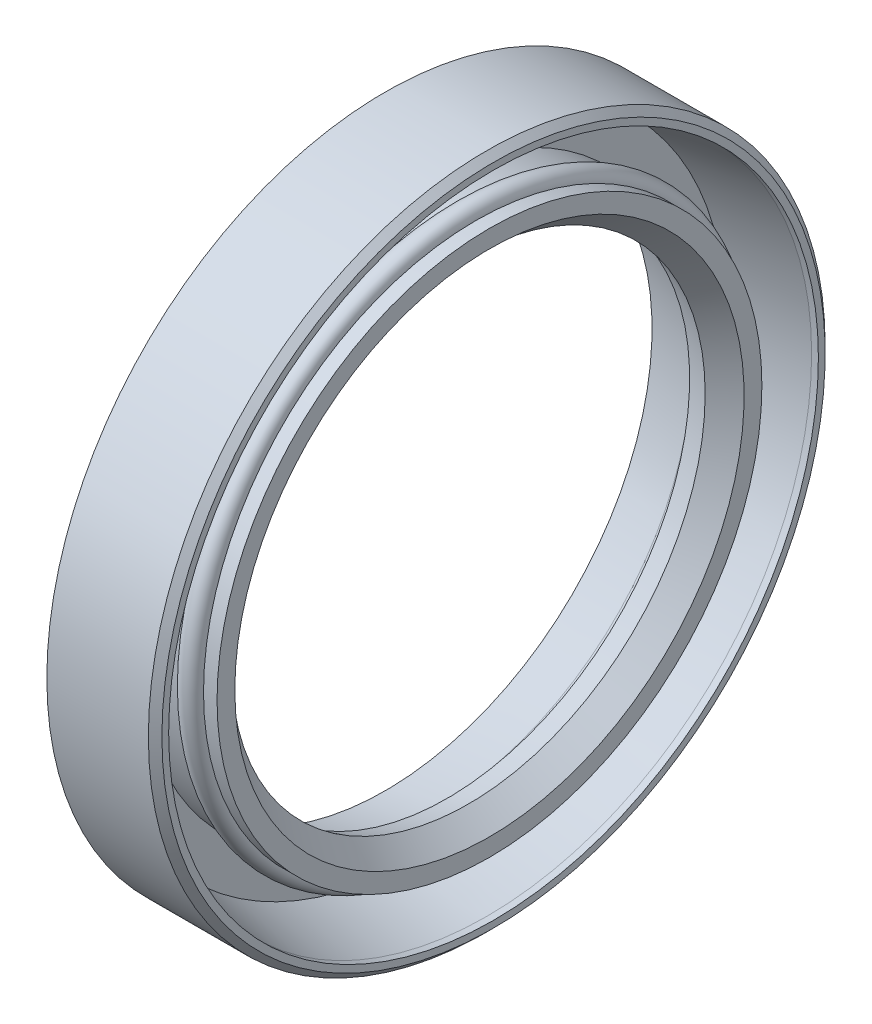
ISO-10303-21;
HEADER;
FILE_DESCRIPTION(('STEP AP214'),'2;1');
FILE_NAME('part.step','',(''),(''),'','','');
FILE_SCHEMA(('AUTOMOTIVE_DESIGN { 1 0 10303 214 1 1 1 1 }'));
ENDSEC;
DATA;
#1=APPLICATION_CONTEXT('core data for automotive mechanical design processes');
#2=APPLICATION_PROTOCOL_DEFINITION('international standard','automotive_design',2000,#1);
#3=PRODUCT_CONTEXT('',#1,'mechanical');
#4=PRODUCT('Part','Part','',(#3));
#5=PRODUCT_RELATED_PRODUCT_CATEGORY('part','',(#4));
#6=PRODUCT_DEFINITION_FORMATION('','',#4);
#7=PRODUCT_DEFINITION_CONTEXT('part definition',#1,'design');
#8=PRODUCT_DEFINITION('design','',#6,#7);
#9=PRODUCT_DEFINITION_SHAPE('','',#8);
#10=(LENGTH_UNIT() NAMED_UNIT(*) SI_UNIT(.MILLI.,.METRE.));
#11=(NAMED_UNIT(*) PLANE_ANGLE_UNIT() SI_UNIT($,.RADIAN.));
#12=(NAMED_UNIT(*) SI_UNIT($,.STERADIAN.) SOLID_ANGLE_UNIT());
#13=UNCERTAINTY_MEASURE_WITH_UNIT(LENGTH_MEASURE(1.E-05),#10,'distance_accuracy_value','');
#14=(GEOMETRIC_REPRESENTATION_CONTEXT(3) GLOBAL_UNCERTAINTY_ASSIGNED_CONTEXT((#13)) GLOBAL_UNIT_ASSIGNED_CONTEXT((#10,
#11,#12)) REPRESENTATION_CONTEXT('',''));
#15=CARTESIAN_POINT('',(0.,0.,0.));
#16=DIRECTION('',(0.,0.,1.));
#17=DIRECTION('',(1.,0.,0.));
#18=AXIS2_PLACEMENT_3D('',#15,#16,#17);
#19=CARTESIAN_POINT('',(7.99999999999999,0.,0.));
#20=DIRECTION('',(-1.,0.,0.));
#21=DIRECTION('',(0.,0.,1.));
#22=AXIS2_PLACEMENT_3D('',#19,#20,#21);
#23=CONICAL_SURFACE('',#22,24.5,0.785398163397448);
#24=CARTESIAN_POINT('',(7.49999999999999,0.,0.));
#25=DIRECTION('',(-1.,0.,0.));
#26=DIRECTION('',(0.,0.,1.));
#27=AXIS2_PLACEMENT_3D('',#24,#25,#26);
#28=CIRCLE('',#27,25.);
#29=CARTESIAN_POINT('',(7.49999999999999,0.,25.));
#30=VERTEX_POINT('',#29);
#31=EDGE_CURVE('E84',#30,#30,#28,.T.);
#32=ORIENTED_EDGE('',*,*,#31,.F.);
#33=EDGE_LOOP('',(#32));
#34=FACE_BOUND('',#33,.T.);
#35=CARTESIAN_POINT('',(7.99999999999999,0.,0.));
#36=DIRECTION('',(-1.,0.,0.));
#37=DIRECTION('',(0.,0.,1.));
#38=AXIS2_PLACEMENT_3D('',#35,#36,#37);
#39=CIRCLE('',#38,24.5);
#40=CARTESIAN_POINT('',(7.99999999999999,0.,24.5));
#41=VERTEX_POINT('',#40);
#42=EDGE_CURVE('E10',#41,#41,#39,.T.);
#43=ORIENTED_EDGE('',*,*,#42,.T.);
#44=EDGE_LOOP('',(#43));
#45=FACE_BOUND('',#44,.T.);
#46=ADVANCED_FACE('F34',(#34,#45),#23,.T.);
#47=CARTESIAN_POINT('',(7.99999999999999,24.,0.));
#48=DIRECTION('',(-1.,0.,0.));
#49=DIRECTION('',(0.,0.,1.));
#50=AXIS2_PLACEMENT_3D('',#47,#48,#49);
#51=PLANE('',#50);
#52=ORIENTED_EDGE('',*,*,#42,.F.);
#53=EDGE_LOOP('',(#52));
#54=FACE_BOUND('',#53,.T.);
#55=CARTESIAN_POINT('',(7.99999999999999,0.,0.));
#56=DIRECTION('',(-1.,0.,0.));
#57=DIRECTION('',(0.,0.,1.));
#58=AXIS2_PLACEMENT_3D('',#55,#56,#57);
#59=CIRCLE('',#58,24.);
#60=CARTESIAN_POINT('',(7.99999999999999,0.,24.));
#61=VERTEX_POINT('',#60);
#62=EDGE_CURVE('E41',#61,#61,#59,.T.);
#63=ORIENTED_EDGE('',*,*,#62,.T.);
#64=EDGE_LOOP('',(#63));
#65=FACE_BOUND('',#64,.T.);
#66=ADVANCED_FACE('F91',(#54,#65),#51,.F.);
#67=CARTESIAN_POINT('',(0.,0.,0.));
#68=DIRECTION('',(-1.,0.,0.));
#69=DIRECTION('',(0.,0.,1.));
#70=AXIS2_PLACEMENT_3D('',#67,#68,#69);
#71=CYLINDRICAL_SURFACE('',#70,24.);
#72=ORIENTED_EDGE('',*,*,#62,.F.);
#73=EDGE_LOOP('',(#72));
#74=FACE_BOUND('',#73,.T.);
#75=CARTESIAN_POINT('',(7.49999999999999,0.,0.));
#76=DIRECTION('',(-1.,0.,0.));
#77=DIRECTION('',(0.,0.,1.));
#78=AXIS2_PLACEMENT_3D('',#75,#76,#77);
#79=CIRCLE('',#78,24.);
#80=CARTESIAN_POINT('',(7.49999999999999,0.,24.));
#81=VERTEX_POINT('',#80);
#82=EDGE_CURVE('E45',#81,#81,#79,.T.);
#83=ORIENTED_EDGE('',*,*,#82,.T.);
#84=EDGE_LOOP('',(#83));
#85=FACE_BOUND('',#84,.T.);
#86=ADVANCED_FACE('F95',(#74,#85),#71,.F.);
#87=CARTESIAN_POINT('',(2.09999999999999,0.,0.));
#88=DIRECTION('',(1.,0.,0.));
#89=DIRECTION('',(0.,0.,-1.));
#90=AXIS2_PLACEMENT_3D('',#87,#88,#89);
#91=CONICAL_SURFACE('',#90,23.0478343041743,0.174532925199431);
#92=ORIENTED_EDGE('',*,*,#82,.F.);
#93=EDGE_LOOP('',(#92));
#94=FACE_BOUND('',#93,.T.);
#95=CARTESIAN_POINT('',(2.09999999999999,0.,0.));
#96=DIRECTION('',(-1.,0.,0.));
#97=DIRECTION('',(0.,0.,1.));
#98=AXIS2_PLACEMENT_3D('',#95,#96,#97);
#99=CIRCLE('',#98,23.0478343041743);
#100=CARTESIAN_POINT('',(2.09999999999999,0.,23.0478343041743));
#101=VERTEX_POINT('',#100);
#102=EDGE_CURVE('E49',#101,#101,#99,.T.);
#103=ORIENTED_EDGE('',*,*,#102,.T.);
#104=EDGE_LOOP('',(#103));
#105=FACE_BOUND('',#104,.T.);
#106=ADVANCED_FACE('F100',(#94,#105),#91,.F.);
#107=CARTESIAN_POINT('',(2.09999999999999,20.1260593367575,0.));
#108=DIRECTION('',(-1.,0.,0.));
#109=DIRECTION('',(0.,0.,1.));
#110=AXIS2_PLACEMENT_3D('',#107,#108,#109);
#111=PLANE('',#110);
#112=ORIENTED_EDGE('',*,*,#102,.F.);
#113=EDGE_LOOP('',(#112));
#114=FACE_BOUND('',#113,.T.);
#115=CARTESIAN_POINT('',(2.09999999999999,0.,0.));
#116=DIRECTION('',(-1.,0.,0.));
#117=DIRECTION('',(0.,0.,1.));
#118=AXIS2_PLACEMENT_3D('',#115,#116,#117);
#119=CIRCLE('',#118,20.1260593367575);
#120=CARTESIAN_POINT('',(2.09999999999999,0.,20.1260593367575));
#121=VERTEX_POINT('',#120);
#122=EDGE_CURVE('E54',#121,#121,#119,.T.);
#123=ORIENTED_EDGE('',*,*,#122,.T.);
#124=EDGE_LOOP('',(#123));
#125=FACE_BOUND('',#124,.T.);
#126=ADVANCED_FACE('F106',(#114,#125),#111,.F.);
#127=CARTESIAN_POINT('',(0.,0.,0.));
#128=DIRECTION('',(-1.,0.,0.));
#129=DIRECTION('',(0.,0.,1.));
#130=AXIS2_PLACEMENT_3D('',#127,#128,#129);
#131=CYLINDRICAL_SURFACE('',#130,20.1260593367575);
#132=ORIENTED_EDGE('',*,*,#122,.F.);
#133=EDGE_LOOP('',(#132));
#134=FACE_BOUND('',#133,.T.);
#135=CARTESIAN_POINT('',(5.09999999999999,0.,0.));
#136=DIRECTION('',(-1.,0.,0.));
#137=DIRECTION('',(0.,0.,1.));
#138=AXIS2_PLACEMENT_3D('',#135,#136,#137);
#139=CIRCLE('',#138,20.1260593367575);
#140=CARTESIAN_POINT('',(5.09999999999999,0.,20.1260593367575));
#141=VERTEX_POINT('',#140);
#142=EDGE_CURVE('E57',#141,#141,#139,.T.);
#143=ORIENTED_EDGE('',*,*,#142,.T.);
#144=EDGE_LOOP('',(#143));
#145=FACE_BOUND('',#144,.T.);
#146=ADVANCED_FACE('F110',(#134,#145),#131,.T.);
#147=CARTESIAN_POINT('',(5.89999999999999,0.,0.));
#148=DIRECTION('',(-1.,0.,0.));
#149=DIRECTION('',(0.,0.,1.));
#150=AXIS2_PLACEMENT_3D('',#147,#148,#149);
#151=TOROIDAL_SURFACE('',#150,20.1260593367575,0.8);
#152=ORIENTED_EDGE('',*,*,#142,.F.);
#153=EDGE_LOOP('',(#152));
#154=FACE_BOUND('',#153,.T.);
#155=CARTESIAN_POINT('',(6.69999999999999,0.,0.));
#156=DIRECTION('',(-1.,0.,0.));
#157=DIRECTION('',(0.,0.,1.));
#158=AXIS2_PLACEMENT_3D('',#155,#156,#157);
#159=CIRCLE('',#158,20.1260593367575);
#160=CARTESIAN_POINT('',(6.69999999999999,0.,20.1260593367575));
#161=VERTEX_POINT('',#160);
#162=EDGE_CURVE('E60',#161,#161,#159,.T.);
#163=ORIENTED_EDGE('',*,*,#162,.T.);
#164=EDGE_LOOP('',(#163));
#165=FACE_BOUND('',#164,.T.);
#166=ADVANCED_FACE('F114',(#154,#165),#151,.T.);
#167=CARTESIAN_POINT('',(0.,0.,0.));
#168=DIRECTION('',(-1.,0.,0.));
#169=DIRECTION('',(0.,0.,1.));
#170=AXIS2_PLACEMENT_3D('',#167,#168,#169);
#171=CYLINDRICAL_SURFACE('',#170,20.1260593367575);
#172=ORIENTED_EDGE('',*,*,#162,.F.);
#173=EDGE_LOOP('',(#172));
#174=FACE_BOUND('',#173,.T.);
#175=CARTESIAN_POINT('',(7.69999999999999,0.,0.));
#176=DIRECTION('',(-1.,0.,0.));
#177=DIRECTION('',(0.,0.,1.));
#178=AXIS2_PLACEMENT_3D('',#175,#176,#177);
#179=CIRCLE('',#178,20.1260593367575);
#180=CARTESIAN_POINT('',(7.69999999999999,0.,20.1260593367575));
#181=VERTEX_POINT('',#180);
#182=EDGE_CURVE('E63',#181,#181,#179,.T.);
#183=ORIENTED_EDGE('',*,*,#182,.T.);
#184=EDGE_LOOP('',(#183));
#185=FACE_BOUND('',#184,.T.);
#186=ADVANCED_FACE('F118',(#174,#185),#171,.T.);
#187=CARTESIAN_POINT('',(7.69999999999999,18.8130296683787,0.));
#188=DIRECTION('',(-1.,0.,0.));
#189=DIRECTION('',(0.,0.,1.));
#190=AXIS2_PLACEMENT_3D('',#187,#188,#189);
#191=PLANE('',#190);
#192=ORIENTED_EDGE('',*,*,#182,.F.);
#193=EDGE_LOOP('',(#192));
#194=FACE_BOUND('',#193,.T.);
#195=CARTESIAN_POINT('',(7.69999999999999,0.,0.));
#196=DIRECTION('',(-1.,0.,0.));
#197=DIRECTION('',(0.,0.,1.));
#198=AXIS2_PLACEMENT_3D('',#195,#196,#197);
#199=CIRCLE('',#198,18.8130296683787);
#200=CARTESIAN_POINT('',(7.69999999999999,0.,18.8130296683787));
#201=VERTEX_POINT('',#200);
#202=EDGE_CURVE('E66',#201,#201,#199,.T.);
#203=ORIENTED_EDGE('',*,*,#202,.T.);
#204=EDGE_LOOP('',(#203));
#205=FACE_BOUND('',#204,.T.);
#206=ADVANCED_FACE('F122',(#194,#205),#191,.F.);
#207=CARTESIAN_POINT('',(6.13519217552685,0.,0.));
#208=DIRECTION('',(1.,0.,0.));
#209=DIRECTION('',(0.,0.,-1.));
#210=AXIS2_PLACEMENT_3D('',#207,#208,#209);
#211=CONICAL_SURFACE('',#210,17.5,0.698131700797733);
#212=ORIENTED_EDGE('',*,*,#202,.F.);
#213=EDGE_LOOP('',(#212));
#214=FACE_BOUND('',#213,.T.);
#215=CARTESIAN_POINT('',(6.13519217552685,0.,0.));
#216=DIRECTION('',(-1.,0.,0.));
#217=DIRECTION('',(0.,0.,1.));
#218=AXIS2_PLACEMENT_3D('',#215,#216,#217);
#219=CIRCLE('',#218,17.5);
#220=CARTESIAN_POINT('',(6.13519217552685,0.,17.5));
#221=VERTEX_POINT('',#220);
#222=EDGE_CURVE('E69',#221,#221,#219,.T.);
#223=ORIENTED_EDGE('',*,*,#222,.T.);
#224=EDGE_LOOP('',(#223));
#225=FACE_BOUND('',#224,.T.);
#226=ADVANCED_FACE('F126',(#214,#225),#211,.F.);
#227=CARTESIAN_POINT('',(4.5703843510537,0.,0.));
#228=DIRECTION('',(-1.,0.,0.));
#229=DIRECTION('',(0.,0.,1.));
#230=AXIS2_PLACEMENT_3D('',#227,#228,#229);
#231=CONICAL_SURFACE('',#230,17.9192889928775,0.261799387799147);
#232=ORIENTED_EDGE('',*,*,#222,.F.);
#233=EDGE_LOOP('',(#232));
#234=FACE_BOUND('',#233,.T.);
#235=CARTESIAN_POINT('',(4.5703843510537,0.,0.));
#236=DIRECTION('',(-1.,0.,0.));
#237=DIRECTION('',(0.,0.,1.));
#238=AXIS2_PLACEMENT_3D('',#235,#236,#237);
#239=CIRCLE('',#238,17.9192889928775);
#240=CARTESIAN_POINT('',(4.5703843510537,0.,17.9192889928775));
#241=VERTEX_POINT('',#240);
#242=EDGE_CURVE('E72',#241,#241,#239,.T.);
#243=ORIENTED_EDGE('',*,*,#242,.T.);
#244=EDGE_LOOP('',(#243));
#245=FACE_BOUND('',#244,.T.);
#246=ADVANCED_FACE('F130',(#234,#245),#231,.F.);
#247=CARTESIAN_POINT('',(3.39608506976939,0.,0.));
#248=DIRECTION('',(-1.,0.,0.));
#249=DIRECTION('',(0.,0.,1.));
#250=AXIS2_PLACEMENT_3D('',#247,#248,#249);
#251=TOROIDAL_SURFACE('',#250,17.9192889928775,1.17429928128431);
#252=ORIENTED_EDGE('',*,*,#242,.F.);
#253=EDGE_LOOP('',(#252));
#254=FACE_BOUND('',#253,.T.);
#255=CARTESIAN_POINT('',(3.59999999999999,0.,0.));
#256=DIRECTION('',(-1.,0.,0.));
#257=DIRECTION('',(0.,0.,1.));
#258=AXIS2_PLACEMENT_3D('',#255,#256,#257);
#259=CIRCLE('',#258,19.0757480294429);
#260=CARTESIAN_POINT('',(3.59999999999999,0.,19.0757480294429));
#261=VERTEX_POINT('',#260);
#262=EDGE_CURVE('E75',#261,#261,#259,.T.);
#263=ORIENTED_EDGE('',*,*,#262,.T.);
#264=EDGE_LOOP('',(#263));
#265=FACE_BOUND('',#264,.T.);
#266=ADVANCED_FACE('F134',(#254,#265),#251,.F.);
#267=CARTESIAN_POINT('',(0.,0.,0.));
#268=DIRECTION('',(-1.,0.,0.));
#269=DIRECTION('',(0.,0.,1.));
#270=AXIS2_PLACEMENT_3D('',#267,#268,#269);
#271=CONICAL_SURFACE('',#270,19.7105251599934,0.17453292519943);
#272=ORIENTED_EDGE('',*,*,#262,.F.);
#273=EDGE_LOOP('',(#272));
#274=FACE_BOUND('',#273,.T.);
#275=CARTESIAN_POINT('',(0.,0.,0.));
#276=DIRECTION('',(-1.,0.,0.));
#277=DIRECTION('',(0.,0.,1.));
#278=AXIS2_PLACEMENT_3D('',#275,#276,#277);
#279=CIRCLE('',#278,19.7105251599934);
#280=CARTESIAN_POINT('',(0.,0.,19.7105251599934));
#281=VERTEX_POINT('',#280);
#282=EDGE_CURVE('E78',#281,#281,#279,.T.);
#283=ORIENTED_EDGE('',*,*,#282,.T.);
#284=EDGE_LOOP('',(#283));
#285=FACE_BOUND('',#284,.T.);
#286=ADVANCED_FACE('F138',(#274,#285),#271,.F.);
#287=CARTESIAN_POINT('',(0.,25.,0.));
#288=DIRECTION('',(1.,0.,0.));
#289=DIRECTION('',(0.,0.,-1.));
#290=AXIS2_PLACEMENT_3D('',#287,#288,#289);
#291=PLANE('',#290);
#292=ORIENTED_EDGE('',*,*,#282,.F.);
#293=EDGE_LOOP('',(#292));
#294=FACE_BOUND('',#293,.T.);
#295=CARTESIAN_POINT('',(0.,0.,0.));
#296=DIRECTION('',(-1.,0.,0.));
#297=DIRECTION('',(0.,0.,1.));
#298=AXIS2_PLACEMENT_3D('',#295,#296,#297);
#299=CIRCLE('',#298,25.);
#300=CARTESIAN_POINT('',(0.,0.,25.));
#301=VERTEX_POINT('',#300);
#302=EDGE_CURVE('E81',#301,#301,#299,.T.);
#303=ORIENTED_EDGE('',*,*,#302,.T.);
#304=EDGE_LOOP('',(#303));
#305=FACE_BOUND('',#304,.T.);
#306=ADVANCED_FACE('F142',(#294,#305),#291,.F.);
#307=CARTESIAN_POINT('',(0.,0.,0.));
#308=DIRECTION('',(-1.,0.,0.));
#309=DIRECTION('',(0.,0.,1.));
#310=AXIS2_PLACEMENT_3D('',#307,#308,#309);
#311=CYLINDRICAL_SURFACE('',#310,25.);
#312=ORIENTED_EDGE('',*,*,#302,.F.);
#313=EDGE_LOOP('',(#312));
#314=FACE_BOUND('',#313,.T.);
#315=ORIENTED_EDGE('',*,*,#31,.T.);
#316=EDGE_LOOP('',(#315));
#317=FACE_BOUND('',#316,.T.);
#318=ADVANCED_FACE('F88',(#314,#317),#311,.T.);
#319=CLOSED_SHELL('',(#46,#66,#86,#106,#126,#146,#166,#186,#206,#226,#246,#266,#286,#306,#318));
#320=CARTESIAN_POINT('',(5.89999999999999,0.,0.));
#321=DIRECTION('',(-1.,0.,0.));
#322=DIRECTION('',(0.,0.,1.));
#323=AXIS2_PLACEMENT_3D('',#320,#321,#322);
#324=TOROIDAL_SURFACE('',#323,20.1260593367575,0.500000000000001);
#325=CARTESIAN_POINT('',(5.89999999999999,0.,20.6260593367575));
#326=VERTEX_POINT('',#325);
#327=VERTEX_LOOP('',#326);
#328=FACE_BOUND('',#327,.T.);
#329=ADVANCED_FACE('F150',(#328),#324,.F.);
#330=CLOSED_SHELL('',(#329));
#331=ORIENTED_CLOSED_SHELL('',*,#330,.T.);
#332=BREP_WITH_VOIDS('B2',#319,(#331));
#333=ADVANCED_BREP_SHAPE_REPRESENTATION('',(#18,#332),#14);
#334=SHAPE_DEFINITION_REPRESENTATION(#9,#333);
ENDSEC;
END-ISO-10303-21;
